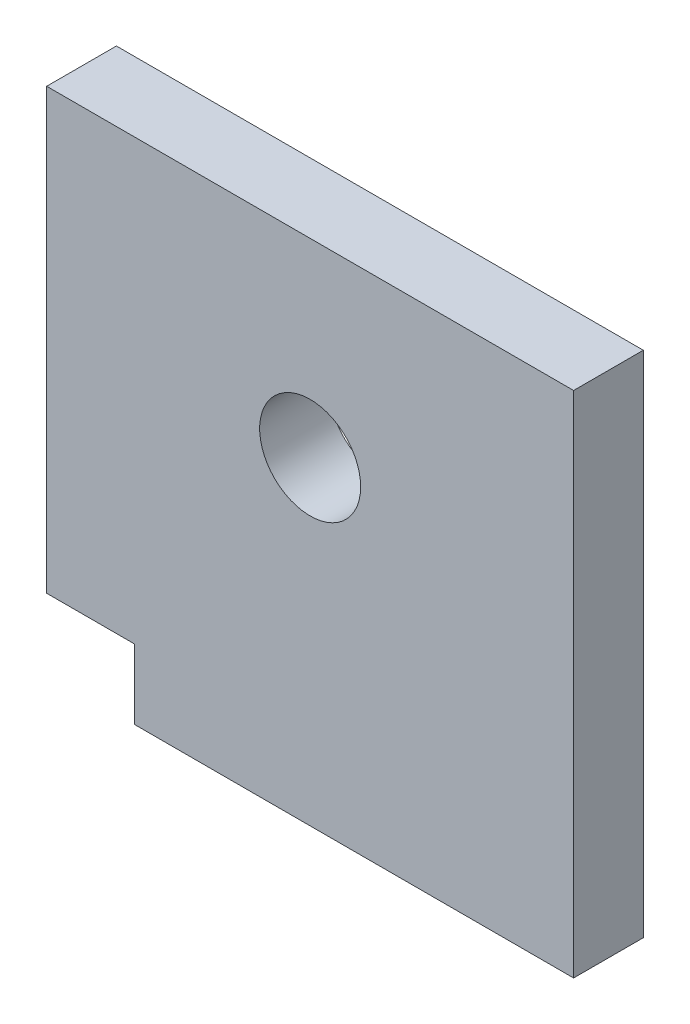
ISO-10303-21;
HEADER;
FILE_DESCRIPTION(('STEP AP214'),'2;1');
FILE_NAME('part.step','',(''),(''),'','','');
FILE_SCHEMA(('AUTOMOTIVE_DESIGN { 1 0 10303 214 1 1 1 1 }'));
ENDSEC;
DATA;
#1=APPLICATION_CONTEXT('core data for automotive mechanical design processes');
#2=APPLICATION_PROTOCOL_DEFINITION('international standard','automotive_design',2000,#1);
#3=PRODUCT_CONTEXT('',#1,'mechanical');
#4=PRODUCT('Part','Part','',(#3));
#5=PRODUCT_RELATED_PRODUCT_CATEGORY('part','',(#4));
#6=PRODUCT_DEFINITION_FORMATION('','',#4);
#7=PRODUCT_DEFINITION_CONTEXT('part definition',#1,'design');
#8=PRODUCT_DEFINITION('design','',#6,#7);
#9=PRODUCT_DEFINITION_SHAPE('','',#8);
#10=(LENGTH_UNIT() NAMED_UNIT(*) SI_UNIT(.MILLI.,.METRE.));
#11=(NAMED_UNIT(*) PLANE_ANGLE_UNIT() SI_UNIT($,.RADIAN.));
#12=(NAMED_UNIT(*) SI_UNIT($,.STERADIAN.) SOLID_ANGLE_UNIT());
#13=UNCERTAINTY_MEASURE_WITH_UNIT(LENGTH_MEASURE(1.E-05),#10,'distance_accuracy_value','');
#14=(GEOMETRIC_REPRESENTATION_CONTEXT(3) GLOBAL_UNCERTAINTY_ASSIGNED_CONTEXT((#13)) GLOBAL_UNIT_ASSIGNED_CONTEXT((#10,
#11,#12)) REPRESENTATION_CONTEXT('',''));
#15=CARTESIAN_POINT('',(0.,0.,0.));
#16=DIRECTION('',(0.,0.,1.));
#17=DIRECTION('',(1.,0.,0.));
#18=AXIS2_PLACEMENT_3D('',#15,#16,#17);
#19=CARTESIAN_POINT('',(0.,0.,3.175));
#20=DIRECTION('',(0.,0.,-1.));
#21=DIRECTION('',(-1.,0.,0.));
#22=AXIS2_PLACEMENT_3D('',#19,#20,#21);
#23=PLANE('',#22);
#24=DIRECTION('',(1.,0.,0.));
#25=VECTOR('',#24,1.);
#26=CARTESIAN_POINT('',(4.,0.,3.175));
#27=LINE('',#26,#25);
#28=CARTESIAN_POINT('',(0.,0.,3.175));
#29=VERTEX_POINT('',#28);
#30=CARTESIAN_POINT('',(4.,0.,3.175));
#31=VERTEX_POINT('',#30);
#32=EDGE_CURVE('E129',#29,#31,#27,.T.);
#33=ORIENTED_EDGE('',*,*,#32,.T.);
#34=DIRECTION('',(0.,-1.,0.));
#35=VECTOR('',#34,1.);
#36=CARTESIAN_POINT('',(4.,-3.175,3.175));
#37=LINE('',#36,#35);
#38=CARTESIAN_POINT('',(4.,-3.175,3.175));
#39=VERTEX_POINT('',#38);
#40=EDGE_CURVE('E87',#31,#39,#37,.T.);
#41=ORIENTED_EDGE('',*,*,#40,.T.);
#42=DIRECTION('',(1.,0.,0.));
#43=VECTOR('',#42,1.);
#44=CARTESIAN_POINT('',(4.,-3.175,3.175));
#45=LINE('',#44,#43);
#46=CARTESIAN_POINT('',(24.,-3.175,3.175));
#47=VERTEX_POINT('',#46);
#48=EDGE_CURVE('E100',#39,#47,#45,.T.);
#49=ORIENTED_EDGE('',*,*,#48,.T.);
#50=DIRECTION('',(0.,1.,0.));
#51=VECTOR('',#50,1.);
#52=CARTESIAN_POINT('',(24.,-3.175,3.175));
#53=LINE('',#52,#51);
#54=CARTESIAN_POINT('',(24.,20.,3.175));
#55=VERTEX_POINT('',#54);
#56=EDGE_CURVE('E94',#47,#55,#53,.T.);
#57=ORIENTED_EDGE('',*,*,#56,.T.);
#58=DIRECTION('',(-1.,0.,0.));
#59=VECTOR('',#58,1.);
#60=CARTESIAN_POINT('',(0.,20.,3.175));
#61=LINE('',#60,#59);
#62=CARTESIAN_POINT('',(0.,20.,3.175));
#63=VERTEX_POINT('',#62);
#64=EDGE_CURVE('E98',#55,#63,#61,.T.);
#65=ORIENTED_EDGE('',*,*,#64,.T.);
#66=DIRECTION('',(0.,-1.,0.));
#67=VECTOR('',#66,1.);
#68=CARTESIAN_POINT('',(0.,0.,3.175));
#69=LINE('',#68,#67);
#70=EDGE_CURVE('E50',#63,#29,#69,.T.);
#71=ORIENTED_EDGE('',*,*,#70,.T.);
#72=EDGE_LOOP('',(#33,#41,#49,#57,#65,#71));
#73=FACE_BOUND('',#72,.T.);
#74=CARTESIAN_POINT('',(12.,11.35,3.175));
#75=DIRECTION('',(0.,0.,1.));
#76=DIRECTION('',(1.,0.,0.));
#77=AXIS2_PLACEMENT_3D('',#74,#75,#76);
#78=CIRCLE('',#77,2.3);
#79=CARTESIAN_POINT('',(14.3,11.35,3.175));
#80=VERTEX_POINT('',#79);
#81=EDGE_CURVE('E121',#80,#80,#78,.T.);
#82=ORIENTED_EDGE('',*,*,#81,.F.);
#83=EDGE_LOOP('',(#82));
#84=FACE_BOUND('',#83,.T.);
#85=ADVANCED_FACE('F33',(#73,#84),#23,.F.);
#86=CARTESIAN_POINT('',(0.,0.,0.));
#87=DIRECTION('',(0.,0.,-1.));
#88=DIRECTION('',(-1.,0.,0.));
#89=AXIS2_PLACEMENT_3D('',#86,#87,#88);
#90=PLANE('',#89);
#91=DIRECTION('',(1.,0.,0.));
#92=VECTOR('',#91,1.);
#93=CARTESIAN_POINT('',(4.,0.,0.));
#94=LINE('',#93,#92);
#95=CARTESIAN_POINT('',(0.,0.,0.));
#96=VERTEX_POINT('',#95);
#97=CARTESIAN_POINT('',(4.,0.,0.));
#98=VERTEX_POINT('',#97);
#99=EDGE_CURVE('E117',#96,#98,#94,.T.);
#100=ORIENTED_EDGE('',*,*,#99,.F.);
#101=DIRECTION('',(0.,-1.,0.));
#102=VECTOR('',#101,1.);
#103=CARTESIAN_POINT('',(0.,0.,0.));
#104=LINE('',#103,#102);
#105=CARTESIAN_POINT('',(0.,20.,0.));
#106=VERTEX_POINT('',#105);
#107=EDGE_CURVE('E79',#106,#96,#104,.T.);
#108=ORIENTED_EDGE('',*,*,#107,.F.);
#109=DIRECTION('',(-1.,0.,0.));
#110=VECTOR('',#109,1.);
#111=CARTESIAN_POINT('',(0.,20.,0.));
#112=LINE('',#111,#110);
#113=CARTESIAN_POINT('',(24.,20.,0.));
#114=VERTEX_POINT('',#113);
#115=EDGE_CURVE('E73',#114,#106,#112,.T.);
#116=ORIENTED_EDGE('',*,*,#115,.F.);
#117=DIRECTION('',(0.,1.,0.));
#118=VECTOR('',#117,1.);
#119=CARTESIAN_POINT('',(24.,0.,0.));
#120=LINE('',#119,#118);
#121=CARTESIAN_POINT('',(24.,-3.175,0.));
#122=VERTEX_POINT('',#121);
#123=EDGE_CURVE('E107',#122,#114,#120,.T.);
#124=ORIENTED_EDGE('',*,*,#123,.F.);
#125=DIRECTION('',(1.,0.,0.));
#126=VECTOR('',#125,1.);
#127=CARTESIAN_POINT('',(4.,-3.175,0.));
#128=LINE('',#127,#126);
#129=CARTESIAN_POINT('',(4.,-3.175,0.));
#130=VERTEX_POINT('',#129);
#131=EDGE_CURVE('E123',#130,#122,#128,.T.);
#132=ORIENTED_EDGE('',*,*,#131,.F.);
#133=DIRECTION('',(0.,-1.,0.));
#134=VECTOR('',#133,1.);
#135=CARTESIAN_POINT('',(4.,-3.175,0.));
#136=LINE('',#135,#134);
#137=EDGE_CURVE('E120',#98,#130,#136,.T.);
#138=ORIENTED_EDGE('',*,*,#137,.F.);
#139=EDGE_LOOP('',(#100,#108,#116,#124,#132,#138));
#140=FACE_BOUND('',#139,.T.);
#141=CARTESIAN_POINT('',(12.,11.35,0.));
#142=DIRECTION('',(0.,0.,1.));
#143=DIRECTION('',(1.,0.,0.));
#144=AXIS2_PLACEMENT_3D('',#141,#142,#143);
#145=CIRCLE('',#144,2.3);
#146=CARTESIAN_POINT('',(14.3,11.35,0.));
#147=VERTEX_POINT('',#146);
#148=EDGE_CURVE('E225',#147,#147,#145,.T.);
#149=ORIENTED_EDGE('',*,*,#148,.T.);
#150=EDGE_LOOP('',(#149));
#151=FACE_BOUND('',#150,.T.);
#152=ADVANCED_FACE('F138',(#140,#151),#90,.T.);
#153=CARTESIAN_POINT('',(4.,0.,3.175));
#154=DIRECTION('',(0.,1.,0.));
#155=DIRECTION('',(-1.,0.,0.));
#156=AXIS2_PLACEMENT_3D('',#153,#154,#155);
#157=PLANE('',#156);
#158=ORIENTED_EDGE('',*,*,#99,.T.);
#159=DIRECTION('',(0.,0.,-1.));
#160=VECTOR('',#159,1.);
#161=CARTESIAN_POINT('',(4.,0.,3.175));
#162=LINE('',#161,#160);
#163=EDGE_CURVE('E11',#31,#98,#162,.T.);
#164=ORIENTED_EDGE('',*,*,#163,.F.);
#165=ORIENTED_EDGE('',*,*,#32,.F.);
#166=DIRECTION('',(0.,0.,-1.));
#167=VECTOR('',#166,1.);
#168=CARTESIAN_POINT('',(0.,0.,3.175));
#169=LINE('',#168,#167);
#170=EDGE_CURVE('E113',#29,#96,#169,.T.);
#171=ORIENTED_EDGE('',*,*,#170,.T.);
#172=EDGE_LOOP('',(#158,#164,#165,#171));
#173=FACE_BOUND('',#172,.T.);
#174=ADVANCED_FACE('F35',(#173),#157,.F.);
#175=CARTESIAN_POINT('',(4.,-3.175,3.175));
#176=DIRECTION('',(1.,0.,0.));
#177=DIRECTION('',(0.,0.,-1.));
#178=AXIS2_PLACEMENT_3D('',#175,#176,#177);
#179=PLANE('',#178);
#180=ORIENTED_EDGE('',*,*,#137,.T.);
#181=DIRECTION('',(0.,0.,-1.));
#182=VECTOR('',#181,1.);
#183=CARTESIAN_POINT('',(4.,-3.175,3.175));
#184=LINE('',#183,#182);
#185=EDGE_CURVE('E42',#39,#130,#184,.T.);
#186=ORIENTED_EDGE('',*,*,#185,.F.);
#187=ORIENTED_EDGE('',*,*,#40,.F.);
#188=ORIENTED_EDGE('',*,*,#163,.T.);
#189=EDGE_LOOP('',(#180,#186,#187,#188));
#190=FACE_BOUND('',#189,.T.);
#191=ADVANCED_FACE('F163',(#190),#179,.F.);
#192=CARTESIAN_POINT('',(4.,-3.175,3.175));
#193=DIRECTION('',(0.,1.,0.));
#194=DIRECTION('',(0.,0.,1.));
#195=AXIS2_PLACEMENT_3D('',#192,#193,#194);
#196=PLANE('',#195);
#197=ORIENTED_EDGE('',*,*,#131,.T.);
#198=DIRECTION('',(0.,0.,-1.));
#199=VECTOR('',#198,1.);
#200=CARTESIAN_POINT('',(24.,-3.175,3.175));
#201=LINE('',#200,#199);
#202=EDGE_CURVE('E108',#47,#122,#201,.T.);
#203=ORIENTED_EDGE('',*,*,#202,.F.);
#204=ORIENTED_EDGE('',*,*,#48,.F.);
#205=ORIENTED_EDGE('',*,*,#185,.T.);
#206=EDGE_LOOP('',(#197,#203,#204,#205));
#207=FACE_BOUND('',#206,.T.);
#208=ADVANCED_FACE('F135',(#207),#196,.F.);
#209=CARTESIAN_POINT('',(24.,0.,3.175));
#210=DIRECTION('',(-1.,0.,0.));
#211=DIRECTION('',(0.,0.,1.));
#212=AXIS2_PLACEMENT_3D('',#209,#210,#211);
#213=PLANE('',#212);
#214=ORIENTED_EDGE('',*,*,#123,.T.);
#215=DIRECTION('',(0.,0.,-1.));
#216=VECTOR('',#215,1.);
#217=CARTESIAN_POINT('',(24.,20.,3.175));
#218=LINE('',#217,#216);
#219=EDGE_CURVE('E105',#55,#114,#218,.T.);
#220=ORIENTED_EDGE('',*,*,#219,.F.);
#221=ORIENTED_EDGE('',*,*,#56,.F.);
#222=ORIENTED_EDGE('',*,*,#202,.T.);
#223=EDGE_LOOP('',(#214,#220,#221,#222));
#224=FACE_BOUND('',#223,.T.);
#225=ADVANCED_FACE('F106',(#224),#213,.F.);
#226=CARTESIAN_POINT('',(0.,20.,3.175));
#227=DIRECTION('',(0.,-1.,0.));
#228=DIRECTION('',(0.,0.,-1.));
#229=AXIS2_PLACEMENT_3D('',#226,#227,#228);
#230=PLANE('',#229);
#231=ORIENTED_EDGE('',*,*,#115,.T.);
#232=DIRECTION('',(0.,0.,-1.));
#233=VECTOR('',#232,1.);
#234=CARTESIAN_POINT('',(0.,20.,3.175));
#235=LINE('',#234,#233);
#236=EDGE_CURVE('E109',#63,#106,#235,.T.);
#237=ORIENTED_EDGE('',*,*,#236,.F.);
#238=ORIENTED_EDGE('',*,*,#64,.F.);
#239=ORIENTED_EDGE('',*,*,#219,.T.);
#240=EDGE_LOOP('',(#231,#237,#238,#239));
#241=FACE_BOUND('',#240,.T.);
#242=ADVANCED_FACE('F111',(#241),#230,.F.);
#243=CARTESIAN_POINT('',(0.,0.,3.175));
#244=DIRECTION('',(1.,0.,0.));
#245=DIRECTION('',(0.,0.,-1.));
#246=AXIS2_PLACEMENT_3D('',#243,#244,#245);
#247=PLANE('',#246);
#248=ORIENTED_EDGE('',*,*,#107,.T.);
#249=ORIENTED_EDGE('',*,*,#170,.F.);
#250=ORIENTED_EDGE('',*,*,#70,.F.);
#251=ORIENTED_EDGE('',*,*,#236,.T.);
#252=EDGE_LOOP('',(#248,#249,#250,#251));
#253=FACE_BOUND('',#252,.T.);
#254=ADVANCED_FACE('F143',(#253),#247,.F.);
#255=CARTESIAN_POINT('',(12.,11.35,3.175));
#256=DIRECTION('',(0.,0.,-1.));
#257=DIRECTION('',(-1.,0.,0.));
#258=AXIS2_PLACEMENT_3D('',#255,#256,#257);
#259=CYLINDRICAL_SURFACE('',#258,2.3);
#260=ORIENTED_EDGE('',*,*,#81,.T.);
#261=EDGE_LOOP('',(#260));
#262=FACE_BOUND('',#261,.T.);
#263=ORIENTED_EDGE('',*,*,#148,.F.);
#264=EDGE_LOOP('',(#263));
#265=FACE_BOUND('',#264,.T.);
#266=ADVANCED_FACE('F145',(#262,#265),#259,.F.);
#267=CLOSED_SHELL('',(#85,#152,#174,#191,#208,#225,#242,#254,#266));
#268=MANIFOLD_SOLID_BREP('B2',#267);
#269=ADVANCED_BREP_SHAPE_REPRESENTATION('',(#18,#268),#14);
#270=SHAPE_DEFINITION_REPRESENTATION(#9,#269);
ENDSEC;
END-ISO-10303-21;
